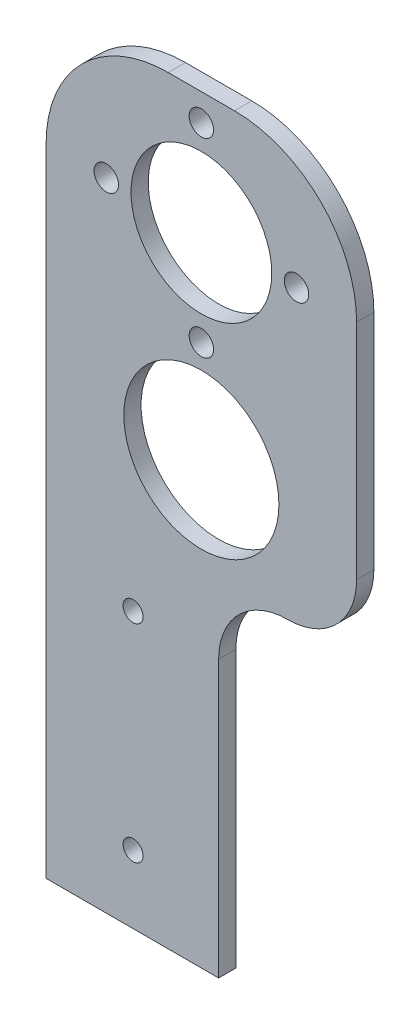
ISO-10303-21;
HEADER;
FILE_DESCRIPTION(('STEP AP214'),'2;1');
FILE_NAME('part.step','',(''),(''),'','','');
FILE_SCHEMA(('AUTOMOTIVE_DESIGN { 1 0 10303 214 1 1 1 1 }'));
ENDSEC;
DATA;
#1=APPLICATION_CONTEXT('core data for automotive mechanical design processes');
#2=APPLICATION_PROTOCOL_DEFINITION('international standard','automotive_design',2000,#1);
#3=PRODUCT_CONTEXT('',#1,'mechanical');
#4=PRODUCT('Part','Part','',(#3));
#5=PRODUCT_RELATED_PRODUCT_CATEGORY('part','',(#4));
#6=PRODUCT_DEFINITION_FORMATION('','',#4);
#7=PRODUCT_DEFINITION_CONTEXT('part definition',#1,'design');
#8=PRODUCT_DEFINITION('design','',#6,#7);
#9=PRODUCT_DEFINITION_SHAPE('','',#8);
#10=(LENGTH_UNIT() NAMED_UNIT(*) SI_UNIT(.MILLI.,.METRE.));
#11=(NAMED_UNIT(*) PLANE_ANGLE_UNIT() SI_UNIT($,.RADIAN.));
#12=(NAMED_UNIT(*) SI_UNIT($,.STERADIAN.) SOLID_ANGLE_UNIT());
#13=UNCERTAINTY_MEASURE_WITH_UNIT(LENGTH_MEASURE(1.E-05),#10,'distance_accuracy_value','');
#14=(GEOMETRIC_REPRESENTATION_CONTEXT(3) GLOBAL_UNCERTAINTY_ASSIGNED_CONTEXT((#13)) GLOBAL_UNIT_ASSIGNED_CONTEXT((#10,
#11,#12)) REPRESENTATION_CONTEXT('',''));
#15=CARTESIAN_POINT('',(0.,0.,0.));
#16=DIRECTION('',(0.,0.,1.));
#17=DIRECTION('',(1.,0.,0.));
#18=AXIS2_PLACEMENT_3D('',#15,#16,#17);
#19=CARTESIAN_POINT('',(0.,0.,3.175));
#20=DIRECTION('',(0.,0.,1.));
#21=DIRECTION('',(1.,0.,0.));
#22=AXIS2_PLACEMENT_3D('',#19,#20,#21);
#23=PLANE('',#22);
#24=CARTESIAN_POINT('',(-12.573,-71.4515584143681,3.175));
#25=DIRECTION('',(0.,0.,1.));
#26=DIRECTION('',(1.,0.,0.));
#27=AXIS2_PLACEMENT_3D('',#24,#25,#26);
#28=CIRCLE('',#27,1.84149999999999);
#29=CARTESIAN_POINT('',(-10.7315,-71.4515584143681,3.175));
#30=VERTEX_POINT('',#29);
#31=EDGE_CURVE('E372',#30,#30,#28,.T.);
#32=ORIENTED_EDGE('',*,*,#31,.F.);
#33=EDGE_LOOP('',(#32));
#34=FACE_BOUND('',#33,.T.);
#35=CARTESIAN_POINT('',(0.,15.7593415856319,3.175));
#36=DIRECTION('',(0.,0.,1.));
#37=DIRECTION('',(1.,0.,0.));
#38=AXIS2_PLACEMENT_3D('',#35,#36,#37);
#39=CIRCLE('',#38,2.25);
#40=CARTESIAN_POINT('',(2.25000000000001,15.7593415856319,3.175));
#41=VERTEX_POINT('',#40);
#42=EDGE_CURVE('E391',#41,#41,#39,.T.);
#43=ORIENTED_EDGE('',*,*,#42,.F.);
#44=EDGE_LOOP('',(#43));
#45=FACE_BOUND('',#44,.T.);
#46=CARTESIAN_POINT('',(0.,-2.93505841436809,3.175));
#47=DIRECTION('',(0.,0.,1.));
#48=DIRECTION('',(1.,0.,0.));
#49=AXIS2_PLACEMENT_3D('',#46,#47,#48);
#50=CIRCLE('',#49,14.2748);
#51=CARTESIAN_POINT('',(14.2748,-2.93505841436809,3.175));
#52=VERTEX_POINT('',#51);
#53=EDGE_CURVE('E403',#52,#52,#50,.T.);
#54=ORIENTED_EDGE('',*,*,#53,.F.);
#55=EDGE_LOOP('',(#54));
#56=FACE_BOUND('',#55,.T.);
#57=CARTESIAN_POINT('',(0.,33.2599415856319,3.175));
#58=DIRECTION('',(0.,0.,1.));
#59=DIRECTION('',(1.,0.,0.));
#60=AXIS2_PLACEMENT_3D('',#57,#58,#59);
#61=CIRCLE('',#60,12.954);
#62=CARTESIAN_POINT('',(12.954,33.2599415856319,3.175));
#63=VERTEX_POINT('',#62);
#64=EDGE_CURVE('E188',#63,#63,#61,.T.);
#65=ORIENTED_EDGE('',*,*,#64,.F.);
#66=EDGE_LOOP('',(#65));
#67=FACE_BOUND('',#66,.T.);
#68=DIRECTION('',(0.,1.,0.));
#69=VECTOR('',#68,1.);
#70=CARTESIAN_POINT('',(3.175,-20.4610584143681,3.175));
#71=LINE('',#70,#69);
#72=CARTESIAN_POINT('',(3.17500000000001,-83.9610584143681,3.175));
#73=VERTEX_POINT('',#72);
#74=CARTESIAN_POINT('',(3.175,-33.1610584143681,3.175));
#75=VERTEX_POINT('',#74);
#76=EDGE_CURVE('E122',#73,#75,#71,.T.);
#77=ORIENTED_EDGE('',*,*,#76,.T.);
#78=CARTESIAN_POINT('',(15.875,-33.1610584143681,3.175));
#79=DIRECTION('',(0.,0.,1.));
#80=DIRECTION('',(1.,0.,0.));
#81=AXIS2_PLACEMENT_3D('',#78,#79,#80);
#82=CIRCLE('',#81,12.7);
#83=CARTESIAN_POINT('',(15.875,-20.4610584143681,3.175));
#84=VERTEX_POINT('',#83);
#85=EDGE_CURVE('E11',#75,#84,#82,.F.);
#86=ORIENTED_EDGE('',*,*,#85,.T.);
#87=CARTESIAN_POINT('',(15.875,-7.76105841436809,3.175));
#88=DIRECTION('',(0.,0.,1.));
#89=DIRECTION('',(1.,0.,0.));
#90=AXIS2_PLACEMENT_3D('',#87,#88,#89);
#91=CIRCLE('',#90,12.7);
#92=CARTESIAN_POINT('',(28.575,-7.76105841436809,3.175));
#93=VERTEX_POINT('',#92);
#94=EDGE_CURVE('E156',#84,#93,#91,.T.);
#95=ORIENTED_EDGE('',*,*,#94,.T.);
#96=DIRECTION('',(0.,1.,0.));
#97=VECTOR('',#96,1.);
#98=CARTESIAN_POINT('',(28.575,55.7389415856319,3.175));
#99=LINE('',#98,#97);
#100=CARTESIAN_POINT('',(28.575,33.2599415856319,3.175));
#101=VERTEX_POINT('',#100);
#102=EDGE_CURVE('E178',#93,#101,#99,.T.);
#103=ORIENTED_EDGE('',*,*,#102,.T.);
#104=CARTESIAN_POINT('',(6.096,33.2599415856319,3.175));
#105=DIRECTION('',(0.,0.,1.));
#106=DIRECTION('',(1.,0.,0.));
#107=AXIS2_PLACEMENT_3D('',#104,#105,#106);
#108=CIRCLE('',#107,22.479);
#109=CARTESIAN_POINT('',(6.096,55.7389415856319,3.175));
#110=VERTEX_POINT('',#109);
#111=EDGE_CURVE('E145',#101,#110,#108,.T.);
#112=ORIENTED_EDGE('',*,*,#111,.T.);
#113=DIRECTION('',(-1.,0.,0.));
#114=VECTOR('',#113,1.);
#115=CARTESIAN_POINT('',(-28.575,55.7389415856319,3.175));
#116=LINE('',#115,#114);
#117=CARTESIAN_POINT('',(-6.096,55.7389415856319,3.175));
#118=VERTEX_POINT('',#117);
#119=EDGE_CURVE('E132',#110,#118,#116,.T.);
#120=ORIENTED_EDGE('',*,*,#119,.T.);
#121=CARTESIAN_POINT('',(-6.09600000000001,33.2599415856319,3.175));
#122=DIRECTION('',(0.,0.,1.));
#123=DIRECTION('',(1.,0.,0.));
#124=AXIS2_PLACEMENT_3D('',#121,#122,#123);
#125=CIRCLE('',#124,22.479);
#126=CARTESIAN_POINT('',(-28.575,33.2599415856319,3.175));
#127=VERTEX_POINT('',#126);
#128=EDGE_CURVE('E109',#118,#127,#125,.T.);
#129=ORIENTED_EDGE('',*,*,#128,.T.);
#130=DIRECTION('',(0.,-1.,0.));
#131=VECTOR('',#130,1.);
#132=CARTESIAN_POINT('',(-28.575,55.7389415856319,3.175));
#133=LINE('',#132,#131);
#134=CARTESIAN_POINT('',(-28.575,-83.9610584143681,3.175));
#135=VERTEX_POINT('',#134);
#136=EDGE_CURVE('E102',#127,#135,#133,.T.);
#137=ORIENTED_EDGE('',*,*,#136,.T.);
#138=DIRECTION('',(1.,0.,0.));
#139=VECTOR('',#138,1.);
#140=CARTESIAN_POINT('',(-28.575,-83.9610584143681,3.175));
#141=LINE('',#140,#139);
#142=EDGE_CURVE('E105',#135,#73,#141,.T.);
#143=ORIENTED_EDGE('',*,*,#142,.T.);
#144=EDGE_LOOP('',(#77,#86,#95,#103,#112,#120,#129,#137,#143));
#145=FACE_BOUND('',#144,.T.);
#146=CARTESIAN_POINT('',(0.,50.7605415856319,3.175));
#147=DIRECTION('',(0.,0.,1.));
#148=DIRECTION('',(1.,0.,0.));
#149=AXIS2_PLACEMENT_3D('',#146,#147,#148);
#150=CIRCLE('',#149,2.25000000000001);
#151=CARTESIAN_POINT('',(2.25000000000001,50.7605415856319,3.175));
#152=VERTEX_POINT('',#151);
#153=EDGE_CURVE('E409',#152,#152,#150,.T.);
#154=ORIENTED_EDGE('',*,*,#153,.F.);
#155=EDGE_LOOP('',(#154));
#156=FACE_BOUND('',#155,.T.);
#157=CARTESIAN_POINT('',(17.5006,33.2599415856319,3.175));
#158=DIRECTION('',(0.,0.,1.));
#159=DIRECTION('',(1.,0.,0.));
#160=AXIS2_PLACEMENT_3D('',#157,#158,#159);
#161=CIRCLE('',#160,2.25);
#162=CARTESIAN_POINT('',(19.7506,33.2599415856319,3.175));
#163=VERTEX_POINT('',#162);
#164=EDGE_CURVE('E397',#163,#163,#161,.T.);
#165=ORIENTED_EDGE('',*,*,#164,.F.);
#166=EDGE_LOOP('',(#165));
#167=FACE_BOUND('',#166,.T.);
#168=CARTESIAN_POINT('',(-17.5006,33.2599415856319,3.175));
#169=DIRECTION('',(0.,0.,1.));
#170=DIRECTION('',(1.,0.,0.));
#171=AXIS2_PLACEMENT_3D('',#168,#169,#170);
#172=CIRCLE('',#171,2.25000000000001);
#173=CARTESIAN_POINT('',(-15.2506,33.2599415856319,3.175));
#174=VERTEX_POINT('',#173);
#175=EDGE_CURVE('E385',#174,#174,#172,.T.);
#176=ORIENTED_EDGE('',*,*,#175,.F.);
#177=EDGE_LOOP('',(#176));
#178=FACE_BOUND('',#177,.T.);
#179=CARTESIAN_POINT('',(-12.573,-33.3515584143681,3.175));
#180=DIRECTION('',(0.,0.,1.));
#181=DIRECTION('',(1.,0.,0.));
#182=AXIS2_PLACEMENT_3D('',#179,#180,#181);
#183=CIRCLE('',#182,1.8415);
#184=CARTESIAN_POINT('',(-10.7315,-33.3515584143681,3.175));
#185=VERTEX_POINT('',#184);
#186=EDGE_CURVE('E377',#185,#185,#183,.T.);
#187=ORIENTED_EDGE('',*,*,#186,.F.);
#188=EDGE_LOOP('',(#187));
#189=FACE_BOUND('',#188,.T.);
#190=ADVANCED_FACE('F32',(#34,#45,#56,#67,#145,#156,#167,#178,#189),#23,.T.);
#191=CARTESIAN_POINT('',(0.,0.,0.));
#192=DIRECTION('',(0.,0.,1.));
#193=DIRECTION('',(1.,0.,0.));
#194=AXIS2_PLACEMENT_3D('',#191,#192,#193);
#195=PLANE('',#194);
#196=DIRECTION('',(0.,1.,0.));
#197=VECTOR('',#196,1.);
#198=CARTESIAN_POINT('',(28.575,55.7389415856319,0.));
#199=LINE('',#198,#197);
#200=CARTESIAN_POINT('',(28.575,-7.76105841436809,0.));
#201=VERTEX_POINT('',#200);
#202=CARTESIAN_POINT('',(28.575,33.2599415856319,0.));
#203=VERTEX_POINT('',#202);
#204=EDGE_CURVE('E169',#201,#203,#199,.T.);
#205=ORIENTED_EDGE('',*,*,#204,.F.);
#206=CARTESIAN_POINT('',(15.875,-7.76105841436809,0.));
#207=DIRECTION('',(0.,0.,1.));
#208=DIRECTION('',(1.,0.,0.));
#209=AXIS2_PLACEMENT_3D('',#206,#207,#208);
#210=CIRCLE('',#209,12.7);
#211=CARTESIAN_POINT('',(15.875,-20.4610584143681,0.));
#212=VERTEX_POINT('',#211);
#213=EDGE_CURVE('E154',#201,#212,#210,.F.);
#214=ORIENTED_EDGE('',*,*,#213,.T.);
#215=CARTESIAN_POINT('',(15.875,-33.1610584143681,0.));
#216=DIRECTION('',(0.,0.,1.));
#217=DIRECTION('',(1.,0.,0.));
#218=AXIS2_PLACEMENT_3D('',#215,#216,#217);
#219=CIRCLE('',#218,12.7);
#220=CARTESIAN_POINT('',(3.175,-33.1610584143681,0.));
#221=VERTEX_POINT('',#220);
#222=EDGE_CURVE('E41',#212,#221,#219,.T.);
#223=ORIENTED_EDGE('',*,*,#222,.T.);
#224=DIRECTION('',(0.,1.,0.));
#225=VECTOR('',#224,1.);
#226=CARTESIAN_POINT('',(3.175,-20.4610584143681,0.));
#227=LINE('',#226,#225);
#228=CARTESIAN_POINT('',(3.17500000000001,-83.9610584143681,0.));
#229=VERTEX_POINT('',#228);
#230=EDGE_CURVE('E165',#229,#221,#227,.T.);
#231=ORIENTED_EDGE('',*,*,#230,.F.);
#232=DIRECTION('',(1.,0.,0.));
#233=VECTOR('',#232,1.);
#234=CARTESIAN_POINT('',(-28.575,-83.9610584143681,0.));
#235=LINE('',#234,#233);
#236=CARTESIAN_POINT('',(-28.575,-83.9610584143681,0.));
#237=VERTEX_POINT('',#236);
#238=EDGE_CURVE('E170',#237,#229,#235,.T.);
#239=ORIENTED_EDGE('',*,*,#238,.F.);
#240=DIRECTION('',(0.,-1.,0.));
#241=VECTOR('',#240,1.);
#242=CARTESIAN_POINT('',(-28.575,55.7389415856319,0.));
#243=LINE('',#242,#241);
#244=CARTESIAN_POINT('',(-28.575,33.2599415856319,0.));
#245=VERTEX_POINT('',#244);
#246=EDGE_CURVE('E126',#245,#237,#243,.T.);
#247=ORIENTED_EDGE('',*,*,#246,.F.);
#248=CARTESIAN_POINT('',(-6.09600000000001,33.2599415856319,0.));
#249=DIRECTION('',(0.,0.,1.));
#250=DIRECTION('',(1.,0.,0.));
#251=AXIS2_PLACEMENT_3D('',#248,#249,#250);
#252=CIRCLE('',#251,22.479);
#253=CARTESIAN_POINT('',(-6.096,55.7389415856319,0.));
#254=VERTEX_POINT('',#253);
#255=EDGE_CURVE('E138',#245,#254,#252,.F.);
#256=ORIENTED_EDGE('',*,*,#255,.T.);
#257=DIRECTION('',(-1.,0.,0.));
#258=VECTOR('',#257,1.);
#259=CARTESIAN_POINT('',(-28.575,55.7389415856319,0.));
#260=LINE('',#259,#258);
#261=CARTESIAN_POINT('',(6.096,55.7389415856319,0.));
#262=VERTEX_POINT('',#261);
#263=EDGE_CURVE('E114',#262,#254,#260,.T.);
#264=ORIENTED_EDGE('',*,*,#263,.F.);
#265=CARTESIAN_POINT('',(6.096,33.2599415856319,0.));
#266=DIRECTION('',(0.,0.,1.));
#267=DIRECTION('',(1.,0.,0.));
#268=AXIS2_PLACEMENT_3D('',#265,#266,#267);
#269=CIRCLE('',#268,22.479);
#270=EDGE_CURVE('E130',#262,#203,#269,.F.);
#271=ORIENTED_EDGE('',*,*,#270,.T.);
#272=EDGE_LOOP('',(#205,#214,#223,#231,#239,#247,#256,#264,#271));
#273=FACE_BOUND('',#272,.T.);
#274=CARTESIAN_POINT('',(0.,33.2599415856319,0.));
#275=DIRECTION('',(0.,0.,1.));
#276=DIRECTION('',(1.,0.,0.));
#277=AXIS2_PLACEMENT_3D('',#274,#275,#276);
#278=CIRCLE('',#277,12.954);
#279=CARTESIAN_POINT('',(12.954,33.2599415856319,0.));
#280=VERTEX_POINT('',#279);
#281=EDGE_CURVE('E412',#280,#280,#278,.T.);
#282=ORIENTED_EDGE('',*,*,#281,.T.);
#283=EDGE_LOOP('',(#282));
#284=FACE_BOUND('',#283,.T.);
#285=CARTESIAN_POINT('',(0.,50.7605415856319,0.));
#286=DIRECTION('',(0.,0.,1.));
#287=DIRECTION('',(1.,0.,0.));
#288=AXIS2_PLACEMENT_3D('',#285,#286,#287);
#289=CIRCLE('',#288,2.25000000000001);
#290=CARTESIAN_POINT('',(2.25000000000001,50.7605415856319,0.));
#291=VERTEX_POINT('',#290);
#292=EDGE_CURVE('E406',#291,#291,#289,.T.);
#293=ORIENTED_EDGE('',*,*,#292,.T.);
#294=EDGE_LOOP('',(#293));
#295=FACE_BOUND('',#294,.T.);
#296=CARTESIAN_POINT('',(0.,-2.93505841436809,0.));
#297=DIRECTION('',(0.,0.,1.));
#298=DIRECTION('',(1.,0.,0.));
#299=AXIS2_PLACEMENT_3D('',#296,#297,#298);
#300=CIRCLE('',#299,14.2748);
#301=CARTESIAN_POINT('',(14.2748,-2.93505841436809,0.));
#302=VERTEX_POINT('',#301);
#303=EDGE_CURVE('E400',#302,#302,#300,.T.);
#304=ORIENTED_EDGE('',*,*,#303,.T.);
#305=EDGE_LOOP('',(#304));
#306=FACE_BOUND('',#305,.T.);
#307=CARTESIAN_POINT('',(17.5006,33.2599415856319,0.));
#308=DIRECTION('',(0.,0.,1.));
#309=DIRECTION('',(1.,0.,0.));
#310=AXIS2_PLACEMENT_3D('',#307,#308,#309);
#311=CIRCLE('',#310,2.25);
#312=CARTESIAN_POINT('',(19.7506,33.2599415856319,0.));
#313=VERTEX_POINT('',#312);
#314=EDGE_CURVE('E394',#313,#313,#311,.T.);
#315=ORIENTED_EDGE('',*,*,#314,.T.);
#316=EDGE_LOOP('',(#315));
#317=FACE_BOUND('',#316,.T.);
#318=CARTESIAN_POINT('',(0.,15.7593415856319,0.));
#319=DIRECTION('',(0.,0.,1.));
#320=DIRECTION('',(1.,0.,0.));
#321=AXIS2_PLACEMENT_3D('',#318,#319,#320);
#322=CIRCLE('',#321,2.25);
#323=CARTESIAN_POINT('',(2.25000000000001,15.7593415856319,0.));
#324=VERTEX_POINT('',#323);
#325=EDGE_CURVE('E388',#324,#324,#322,.T.);
#326=ORIENTED_EDGE('',*,*,#325,.T.);
#327=EDGE_LOOP('',(#326));
#328=FACE_BOUND('',#327,.T.);
#329=CARTESIAN_POINT('',(-17.5006,33.2599415856319,0.));
#330=DIRECTION('',(0.,0.,1.));
#331=DIRECTION('',(1.,0.,0.));
#332=AXIS2_PLACEMENT_3D('',#329,#330,#331);
#333=CIRCLE('',#332,2.25000000000001);
#334=CARTESIAN_POINT('',(-15.2506,33.2599415856319,0.));
#335=VERTEX_POINT('',#334);
#336=EDGE_CURVE('E379',#335,#335,#333,.T.);
#337=ORIENTED_EDGE('',*,*,#336,.T.);
#338=EDGE_LOOP('',(#337));
#339=FACE_BOUND('',#338,.T.);
#340=CARTESIAN_POINT('',(-12.573,-71.4515584143681,0.));
#341=DIRECTION('',(0.,0.,1.));
#342=DIRECTION('',(1.,0.,0.));
#343=AXIS2_PLACEMENT_3D('',#340,#341,#342);
#344=CIRCLE('',#343,1.84149999999999);
#345=CARTESIAN_POINT('',(-10.7315,-71.4515584143681,0.));
#346=VERTEX_POINT('',#345);
#347=EDGE_CURVE('E375',#346,#346,#344,.T.);
#348=ORIENTED_EDGE('',*,*,#347,.T.);
#349=EDGE_LOOP('',(#348));
#350=FACE_BOUND('',#349,.T.);
#351=CARTESIAN_POINT('',(-12.573,-33.3515584143681,0.));
#352=DIRECTION('',(0.,0.,1.));
#353=DIRECTION('',(1.,0.,0.));
#354=AXIS2_PLACEMENT_3D('',#351,#352,#353);
#355=CIRCLE('',#354,1.8415);
#356=CARTESIAN_POINT('',(-10.7315,-33.3515584143681,0.));
#357=VERTEX_POINT('',#356);
#358=EDGE_CURVE('E174',#357,#357,#355,.T.);
#359=ORIENTED_EDGE('',*,*,#358,.T.);
#360=EDGE_LOOP('',(#359));
#361=FACE_BOUND('',#360,.T.);
#362=ADVANCED_FACE('F163',(#273,#284,#295,#306,#317,#328,#339,#350,#361),#195,.F.);
#363=CARTESIAN_POINT('',(-28.575,55.7389415856319,3.175));
#364=DIRECTION('',(1.,0.,0.));
#365=DIRECTION('',(0.,1.,0.));
#366=AXIS2_PLACEMENT_3D('',#363,#364,#365);
#367=PLANE('',#366);
#368=ORIENTED_EDGE('',*,*,#136,.F.);
#369=DIRECTION('',(0.,0.,-1.));
#370=VECTOR('',#369,1.);
#371=CARTESIAN_POINT('',(-28.575,33.2599415856319,3.175));
#372=LINE('',#371,#370);
#373=EDGE_CURVE('E128',#127,#245,#372,.T.);
#374=ORIENTED_EDGE('',*,*,#373,.T.);
#375=ORIENTED_EDGE('',*,*,#246,.T.);
#376=DIRECTION('',(0.,0.,-1.));
#377=VECTOR('',#376,1.);
#378=CARTESIAN_POINT('',(-28.575,-83.9610584143681,3.175));
#379=LINE('',#378,#377);
#380=EDGE_CURVE('E119',#135,#237,#379,.T.);
#381=ORIENTED_EDGE('',*,*,#380,.F.);
#382=EDGE_LOOP('',(#368,#374,#375,#381));
#383=FACE_BOUND('',#382,.T.);
#384=ADVANCED_FACE('F124',(#383),#367,.F.);
#385=CARTESIAN_POINT('',(-28.575,-83.9610584143681,3.175));
#386=DIRECTION('',(0.,1.,0.));
#387=DIRECTION('',(-1.,0.,0.));
#388=AXIS2_PLACEMENT_3D('',#385,#386,#387);
#389=PLANE('',#388);
#390=ORIENTED_EDGE('',*,*,#238,.T.);
#391=DIRECTION('',(0.,0.,-1.));
#392=VECTOR('',#391,1.);
#393=CARTESIAN_POINT('',(3.17500000000001,-83.9610584143681,3.175));
#394=LINE('',#393,#392);
#395=EDGE_CURVE('E121',#73,#229,#394,.T.);
#396=ORIENTED_EDGE('',*,*,#395,.F.);
#397=ORIENTED_EDGE('',*,*,#142,.F.);
#398=ORIENTED_EDGE('',*,*,#380,.T.);
#399=EDGE_LOOP('',(#390,#396,#397,#398));
#400=FACE_BOUND('',#399,.T.);
#401=ADVANCED_FACE('F118',(#400),#389,.F.);
#402=CARTESIAN_POINT('',(3.175,-20.4610584143681,3.175));
#403=DIRECTION('',(-1.,0.,0.));
#404=DIRECTION('',(0.,-1.,0.));
#405=AXIS2_PLACEMENT_3D('',#402,#403,#404);
#406=PLANE('',#405);
#407=ORIENTED_EDGE('',*,*,#230,.T.);
#408=DIRECTION('',(0.,0.,-1.));
#409=VECTOR('',#408,1.);
#410=CARTESIAN_POINT('',(3.175,-33.1610584143681,3.175));
#411=LINE('',#410,#409);
#412=EDGE_CURVE('E54',#221,#75,#411,.F.);
#413=ORIENTED_EDGE('',*,*,#412,.T.);
#414=ORIENTED_EDGE('',*,*,#76,.F.);
#415=ORIENTED_EDGE('',*,*,#395,.T.);
#416=EDGE_LOOP('',(#407,#413,#414,#415));
#417=FACE_BOUND('',#416,.T.);
#418=ADVANCED_FACE('F168',(#417),#406,.F.);
#419=CARTESIAN_POINT('',(28.575,55.7389415856319,3.175));
#420=DIRECTION('',(-1.,0.,0.));
#421=DIRECTION('',(0.,-1.,0.));
#422=AXIS2_PLACEMENT_3D('',#419,#420,#421);
#423=PLANE('',#422);
#424=ORIENTED_EDGE('',*,*,#102,.F.);
#425=DIRECTION('',(0.,0.,-1.));
#426=VECTOR('',#425,1.);
#427=CARTESIAN_POINT('',(28.575,-7.76105841436809,3.175));
#428=LINE('',#427,#426);
#429=EDGE_CURVE('E151',#93,#201,#428,.T.);
#430=ORIENTED_EDGE('',*,*,#429,.T.);
#431=ORIENTED_EDGE('',*,*,#204,.T.);
#432=DIRECTION('',(0.,0.,-1.));
#433=VECTOR('',#432,1.);
#434=CARTESIAN_POINT('',(28.575,33.2599415856319,3.175));
#435=LINE('',#434,#433);
#436=EDGE_CURVE('E148',#203,#101,#435,.F.);
#437=ORIENTED_EDGE('',*,*,#436,.T.);
#438=EDGE_LOOP('',(#424,#430,#431,#437));
#439=FACE_BOUND('',#438,.T.);
#440=ADVANCED_FACE('F180',(#439),#423,.F.);
#441=CARTESIAN_POINT('',(-28.575,55.7389415856319,3.175));
#442=DIRECTION('',(0.,-1.,0.));
#443=DIRECTION('',(1.,0.,0.));
#444=AXIS2_PLACEMENT_3D('',#441,#442,#443);
#445=PLANE('',#444);
#446=ORIENTED_EDGE('',*,*,#263,.T.);
#447=DIRECTION('',(0.,0.,-1.));
#448=VECTOR('',#447,1.);
#449=CARTESIAN_POINT('',(-6.096,55.7389415856319,3.175));
#450=LINE('',#449,#448);
#451=EDGE_CURVE('E143',#254,#118,#450,.F.);
#452=ORIENTED_EDGE('',*,*,#451,.T.);
#453=ORIENTED_EDGE('',*,*,#119,.F.);
#454=DIRECTION('',(0.,0.,-1.));
#455=VECTOR('',#454,1.);
#456=CARTESIAN_POINT('',(6.096,55.7389415856319,3.175));
#457=LINE('',#456,#455);
#458=EDGE_CURVE('E140',#110,#262,#457,.T.);
#459=ORIENTED_EDGE('',*,*,#458,.T.);
#460=EDGE_LOOP('',(#446,#452,#453,#459));
#461=FACE_BOUND('',#460,.T.);
#462=ADVANCED_FACE('F194',(#461),#445,.F.);
#463=CARTESIAN_POINT('',(0.,33.2599415856319,3.175));
#464=DIRECTION('',(0.,0.,-1.));
#465=DIRECTION('',(-1.,0.,0.));
#466=AXIS2_PLACEMENT_3D('',#463,#464,#465);
#467=CYLINDRICAL_SURFACE('',#466,12.954);
#468=ORIENTED_EDGE('',*,*,#64,.T.);
#469=EDGE_LOOP('',(#468));
#470=FACE_BOUND('',#469,.T.);
#471=ORIENTED_EDGE('',*,*,#281,.F.);
#472=EDGE_LOOP('',(#471));
#473=FACE_BOUND('',#472,.T.);
#474=ADVANCED_FACE('F223',(#470,#473),#467,.F.);
#475=CARTESIAN_POINT('',(0.,50.7605415856319,3.175));
#476=DIRECTION('',(0.,0.,-1.));
#477=DIRECTION('',(-1.,0.,0.));
#478=AXIS2_PLACEMENT_3D('',#475,#476,#477);
#479=CYLINDRICAL_SURFACE('',#478,2.25000000000001);
#480=ORIENTED_EDGE('',*,*,#153,.T.);
#481=EDGE_LOOP('',(#480));
#482=FACE_BOUND('',#481,.T.);
#483=ORIENTED_EDGE('',*,*,#292,.F.);
#484=EDGE_LOOP('',(#483));
#485=FACE_BOUND('',#484,.T.);
#486=ADVANCED_FACE('F262',(#482,#485),#479,.F.);
#487=CARTESIAN_POINT('',(0.,-2.93505841436809,3.175));
#488=DIRECTION('',(0.,0.,-1.));
#489=DIRECTION('',(-1.,0.,0.));
#490=AXIS2_PLACEMENT_3D('',#487,#488,#489);
#491=CYLINDRICAL_SURFACE('',#490,14.2748);
#492=ORIENTED_EDGE('',*,*,#53,.T.);
#493=EDGE_LOOP('',(#492));
#494=FACE_BOUND('',#493,.T.);
#495=ORIENTED_EDGE('',*,*,#303,.F.);
#496=EDGE_LOOP('',(#495));
#497=FACE_BOUND('',#496,.T.);
#498=ADVANCED_FACE('F269',(#494,#497),#491,.F.);
#499=CARTESIAN_POINT('',(17.5006,33.2599415856319,3.175));
#500=DIRECTION('',(0.,0.,-1.));
#501=DIRECTION('',(-1.,0.,0.));
#502=AXIS2_PLACEMENT_3D('',#499,#500,#501);
#503=CYLINDRICAL_SURFACE('',#502,2.25);
#504=ORIENTED_EDGE('',*,*,#164,.T.);
#505=EDGE_LOOP('',(#504));
#506=FACE_BOUND('',#505,.T.);
#507=ORIENTED_EDGE('',*,*,#314,.F.);
#508=EDGE_LOOP('',(#507));
#509=FACE_BOUND('',#508,.T.);
#510=ADVANCED_FACE('F276',(#506,#509),#503,.F.);
#511=CARTESIAN_POINT('',(0.,15.7593415856319,3.175));
#512=DIRECTION('',(0.,0.,-1.));
#513=DIRECTION('',(-1.,0.,0.));
#514=AXIS2_PLACEMENT_3D('',#511,#512,#513);
#515=CYLINDRICAL_SURFACE('',#514,2.25);
#516=ORIENTED_EDGE('',*,*,#42,.T.);
#517=EDGE_LOOP('',(#516));
#518=FACE_BOUND('',#517,.T.);
#519=ORIENTED_EDGE('',*,*,#325,.F.);
#520=EDGE_LOOP('',(#519));
#521=FACE_BOUND('',#520,.T.);
#522=ADVANCED_FACE('F284',(#518,#521),#515,.F.);
#523=CARTESIAN_POINT('',(-17.5006,33.2599415856319,3.175));
#524=DIRECTION('',(0.,0.,-1.));
#525=DIRECTION('',(-1.,0.,0.));
#526=AXIS2_PLACEMENT_3D('',#523,#524,#525);
#527=CYLINDRICAL_SURFACE('',#526,2.25000000000001);
#528=ORIENTED_EDGE('',*,*,#175,.T.);
#529=EDGE_LOOP('',(#528));
#530=FACE_BOUND('',#529,.T.);
#531=ORIENTED_EDGE('',*,*,#336,.F.);
#532=EDGE_LOOP('',(#531));
#533=FACE_BOUND('',#532,.T.);
#534=ADVANCED_FACE('F292',(#530,#533),#527,.F.);
#535=CARTESIAN_POINT('',(-12.573,-71.4515584143681,3.175));
#536=DIRECTION('',(0.,0.,-1.));
#537=DIRECTION('',(-1.,0.,0.));
#538=AXIS2_PLACEMENT_3D('',#535,#536,#537);
#539=CYLINDRICAL_SURFACE('',#538,1.84149999999999);
#540=ORIENTED_EDGE('',*,*,#31,.T.);
#541=EDGE_LOOP('',(#540));
#542=FACE_BOUND('',#541,.T.);
#543=ORIENTED_EDGE('',*,*,#347,.F.);
#544=EDGE_LOOP('',(#543));
#545=FACE_BOUND('',#544,.T.);
#546=ADVANCED_FACE('F209',(#542,#545),#539,.F.);
#547=CARTESIAN_POINT('',(-12.573,-33.3515584143681,3.175));
#548=DIRECTION('',(0.,0.,-1.));
#549=DIRECTION('',(-1.,0.,0.));
#550=AXIS2_PLACEMENT_3D('',#547,#548,#549);
#551=CYLINDRICAL_SURFACE('',#550,1.8415);
#552=ORIENTED_EDGE('',*,*,#186,.T.);
#553=EDGE_LOOP('',(#552));
#554=FACE_BOUND('',#553,.T.);
#555=ORIENTED_EDGE('',*,*,#358,.F.);
#556=EDGE_LOOP('',(#555));
#557=FACE_BOUND('',#556,.T.);
#558=ADVANCED_FACE('F201',(#554,#557),#551,.F.);
#559=CARTESIAN_POINT('',(-6.09600000000001,33.2599415856319,3.175));
#560=DIRECTION('',(0.,0.,-1.));
#561=DIRECTION('',(-1.,0.,0.));
#562=AXIS2_PLACEMENT_3D('',#559,#560,#561);
#563=CYLINDRICAL_SURFACE('',#562,22.479);
#564=ORIENTED_EDGE('',*,*,#128,.F.);
#565=ORIENTED_EDGE('',*,*,#451,.F.);
#566=ORIENTED_EDGE('',*,*,#255,.F.);
#567=ORIENTED_EDGE('',*,*,#373,.F.);
#568=EDGE_LOOP('',(#564,#565,#566,#567));
#569=FACE_BOUND('',#568,.T.);
#570=ADVANCED_FACE('F198',(#569),#563,.T.);
#571=CARTESIAN_POINT('',(6.096,33.2599415856319,3.175));
#572=DIRECTION('',(0.,0.,-1.));
#573=DIRECTION('',(-1.,0.,0.));
#574=AXIS2_PLACEMENT_3D('',#571,#572,#573);
#575=CYLINDRICAL_SURFACE('',#574,22.479);
#576=ORIENTED_EDGE('',*,*,#111,.F.);
#577=ORIENTED_EDGE('',*,*,#436,.F.);
#578=ORIENTED_EDGE('',*,*,#270,.F.);
#579=ORIENTED_EDGE('',*,*,#458,.F.);
#580=EDGE_LOOP('',(#576,#577,#578,#579));
#581=FACE_BOUND('',#580,.T.);
#582=ADVANCED_FACE('F200',(#581),#575,.T.);
#583=CARTESIAN_POINT('',(15.875,-33.1610584143681,3.175));
#584=DIRECTION('',(0.,0.,1.));
#585=DIRECTION('',(1.,0.,0.));
#586=AXIS2_PLACEMENT_3D('',#583,#584,#585);
#587=CYLINDRICAL_SURFACE('',#586,12.7);
#588=DIRECTION('',(0.,0.,-1.));
#589=VECTOR('',#588,1.);
#590=CARTESIAN_POINT('',(15.875,-20.4610584143681,0.));
#591=LINE('',#590,#589);
#592=EDGE_CURVE('E36',#84,#212,#591,.T.);
#593=ORIENTED_EDGE('',*,*,#592,.F.);
#594=ORIENTED_EDGE('',*,*,#85,.F.);
#595=ORIENTED_EDGE('',*,*,#412,.F.);
#596=ORIENTED_EDGE('',*,*,#222,.F.);
#597=EDGE_LOOP('',(#593,#594,#595,#596));
#598=FACE_BOUND('',#597,.T.);
#599=ADVANCED_FACE('F34',(#598),#587,.F.);
#600=CARTESIAN_POINT('',(15.875,-7.76105841436809,3.175));
#601=DIRECTION('',(0.,0.,-1.));
#602=DIRECTION('',(-1.,0.,0.));
#603=AXIS2_PLACEMENT_3D('',#600,#601,#602);
#604=CYLINDRICAL_SURFACE('',#603,12.7);
#605=ORIENTED_EDGE('',*,*,#94,.F.);
#606=ORIENTED_EDGE('',*,*,#592,.T.);
#607=ORIENTED_EDGE('',*,*,#213,.F.);
#608=ORIENTED_EDGE('',*,*,#429,.F.);
#609=EDGE_LOOP('',(#605,#606,#607,#608));
#610=FACE_BOUND('',#609,.T.);
#611=ADVANCED_FACE('F176',(#610),#604,.T.);
#612=CLOSED_SHELL('',(#190,#362,#384,#401,#418,#440,#462,#474,#486,#498,#510,#522,#534,#546,
#558,#570,#582,#599,#611));
#613=MANIFOLD_SOLID_BREP('B2',#612);
#614=ADVANCED_BREP_SHAPE_REPRESENTATION('',(#18,#613),#14);
#615=SHAPE_DEFINITION_REPRESENTATION(#9,#614);
ENDSEC;
END-ISO-10303-21;
